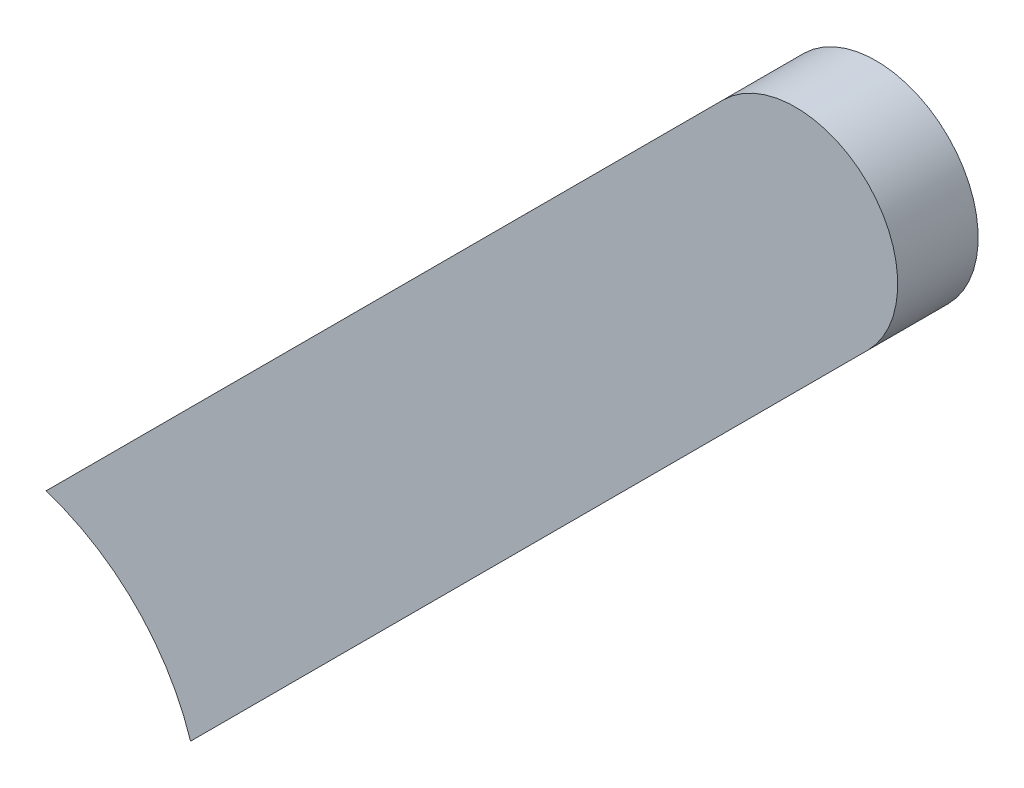
ISO-10303-21;
HEADER;
FILE_DESCRIPTION(('STEP AP214'),'2;1');
FILE_NAME('part.step','',(''),(''),'','','');
FILE_SCHEMA(('AUTOMOTIVE_DESIGN { 1 0 10303 214 1 1 1 1 }'));
ENDSEC;
DATA;
#1=APPLICATION_CONTEXT('core data for automotive mechanical design processes');
#2=APPLICATION_PROTOCOL_DEFINITION('international standard','automotive_design',2000,#1);
#3=PRODUCT_CONTEXT('',#1,'mechanical');
#4=PRODUCT('Part','Part','',(#3));
#5=PRODUCT_RELATED_PRODUCT_CATEGORY('part','',(#4));
#6=PRODUCT_DEFINITION_FORMATION('','',#4);
#7=PRODUCT_DEFINITION_CONTEXT('part definition',#1,'design');
#8=PRODUCT_DEFINITION('design','',#6,#7);
#9=PRODUCT_DEFINITION_SHAPE('','',#8);
#10=(LENGTH_UNIT() NAMED_UNIT(*) SI_UNIT(.MILLI.,.METRE.));
#11=(NAMED_UNIT(*) PLANE_ANGLE_UNIT() SI_UNIT($,.RADIAN.));
#12=(NAMED_UNIT(*) SI_UNIT($,.STERADIAN.) SOLID_ANGLE_UNIT());
#13=UNCERTAINTY_MEASURE_WITH_UNIT(LENGTH_MEASURE(1.E-05),#10,'distance_accuracy_value','');
#14=(GEOMETRIC_REPRESENTATION_CONTEXT(3) GLOBAL_UNCERTAINTY_ASSIGNED_CONTEXT((#13)) GLOBAL_UNIT_ASSIGNED_CONTEXT((#10,
#11,#12)) REPRESENTATION_CONTEXT('',''));
#15=CARTESIAN_POINT('',(0.,0.,0.));
#16=DIRECTION('',(0.,0.,1.));
#17=DIRECTION('',(1.,0.,0.));
#18=AXIS2_PLACEMENT_3D('',#15,#16,#17);
#19=CARTESIAN_POINT('',(134.259538404847,86.0183318648469,0.));
#20=DIRECTION('',(-0.707106781186548,0.707106781186548,0.));
#21=DIRECTION('',(0.707106781186548,0.707106781186548,0.));
#22=AXIS2_PLACEMENT_3D('',#19,#20,#21);
#23=PLANE('',#22);
#24=DIRECTION('',(0.707106781186548,0.707106781186548,0.));
#25=VECTOR('',#24,1.);
#26=CARTESIAN_POINT('',(133.91060594,85.6693994,0.1999996));
#27=LINE('',#26,#25);
#28=CARTESIAN_POINT('',(134.259538404847,86.0183318648469,0.1999996));
#29=VERTEX_POINT('',#28);
#30=CARTESIAN_POINT('',(135.9426034,87.70139686,0.1999996));
#31=VERTEX_POINT('',#30);
#32=EDGE_CURVE('E11',#29,#31,#27,.T.);
#33=ORIENTED_EDGE('',*,*,#32,.F.);
#34=DIRECTION('',(0.,0.,1.));
#35=VECTOR('',#34,1.);
#36=CARTESIAN_POINT('',(134.259538404847,86.0183318648469,0.));
#37=LINE('',#36,#35);
#38=CARTESIAN_POINT('',(134.259538404847,86.0183318648469,0.));
#39=VERTEX_POINT('',#38);
#40=EDGE_CURVE('E24',#39,#29,#37,.T.);
#41=ORIENTED_EDGE('',*,*,#40,.F.);
#42=DIRECTION('',(0.707106781186548,0.707106781186548,0.));
#43=VECTOR('',#42,1.);
#44=CARTESIAN_POINT('',(133.91060594,85.6693994,0.));
#45=LINE('',#44,#43);
#46=CARTESIAN_POINT('',(135.9426034,87.70139686,0.));
#47=VERTEX_POINT('',#46);
#48=EDGE_CURVE('E75',#39,#47,#45,.T.);
#49=ORIENTED_EDGE('',*,*,#48,.T.);
#50=DIRECTION('',(0.,0.,1.));
#51=VECTOR('',#50,1.);
#52=CARTESIAN_POINT('',(135.9426034,87.70139686,0.));
#53=LINE('',#52,#51);
#54=EDGE_CURVE('E37',#47,#31,#53,.T.);
#55=ORIENTED_EDGE('',*,*,#54,.T.);
#56=EDGE_LOOP('',(#33,#41,#49,#55));
#57=FACE_BOUND('',#56,.T.);
#58=ADVANCED_FACE('F17',(#57),#23,.F.);
#59=CARTESIAN_POINT('',(135.76299873,87.88100153,0.));
#60=DIRECTION('',(0.,0.,-1.));
#61=DIRECTION('',(0.707106781186576,-0.70710678118652,0.));
#62=AXIS2_PLACEMENT_3D('',#59,#60,#61);
#63=CYLINDRICAL_SURFACE('',#62,0.253999360179546);
#64=CARTESIAN_POINT('',(135.76299873,87.88100153,0.1999996));
#65=DIRECTION('',(0.,0.,1.));
#66=DIRECTION('',(0.707106781186576,-0.70710678118652,0.));
#67=AXIS2_PLACEMENT_3D('',#64,#65,#66);
#68=CIRCLE('',#67,0.253999360179546);
#69=CARTESIAN_POINT('',(135.58339406,88.0606062,0.1999996));
#70=VERTEX_POINT('',#69);
#71=EDGE_CURVE('E83',#31,#70,#68,.T.);
#72=ORIENTED_EDGE('',*,*,#71,.F.);
#73=ORIENTED_EDGE('',*,*,#54,.F.);
#74=CARTESIAN_POINT('',(135.76299873,87.88100153,0.));
#75=DIRECTION('',(0.,0.,1.));
#76=DIRECTION('',(0.707106781186576,-0.70710678118652,0.));
#77=AXIS2_PLACEMENT_3D('',#74,#75,#76);
#78=CIRCLE('',#77,0.253999360179546);
#79=CARTESIAN_POINT('',(135.58339406,88.0606062,0.));
#80=VERTEX_POINT('',#79);
#81=EDGE_CURVE('E81',#47,#80,#78,.T.);
#82=ORIENTED_EDGE('',*,*,#81,.T.);
#83=DIRECTION('',(0.,0.,1.));
#84=VECTOR('',#83,1.);
#85=CARTESIAN_POINT('',(135.58339406,88.0606062,0.));
#86=LINE('',#85,#84);
#87=EDGE_CURVE('E67',#80,#70,#86,.T.);
#88=ORIENTED_EDGE('',*,*,#87,.T.);
#89=EDGE_LOOP('',(#72,#73,#82,#88));
#90=FACE_BOUND('',#89,.T.);
#91=ADVANCED_FACE('F89',(#90),#63,.T.);
#92=CARTESIAN_POINT('',(135.58339406,88.0606062,0.));
#93=DIRECTION('',(0.70710678118655,-0.707106781186545,0.));
#94=DIRECTION('',(-0.707106781186545,-0.70710678118655,0.));
#95=AXIS2_PLACEMENT_3D('',#92,#93,#94);
#96=PLANE('',#95);
#97=DIRECTION('',(-0.707106781186545,-0.70710678118655,0.));
#98=VECTOR('',#97,1.);
#99=CARTESIAN_POINT('',(135.58339406,88.0606062,0.1999996));
#100=LINE('',#99,#98);
#101=CARTESIAN_POINT('',(133.900329064847,86.3775412048469,0.1999996));
#102=VERTEX_POINT('',#101);
#103=EDGE_CURVE('E71',#70,#102,#100,.T.);
#104=ORIENTED_EDGE('',*,*,#103,.F.);
#105=ORIENTED_EDGE('',*,*,#87,.F.);
#106=DIRECTION('',(-0.707106781186545,-0.70710678118655,0.));
#107=VECTOR('',#106,1.);
#108=CARTESIAN_POINT('',(135.58339406,88.0606062,0.));
#109=LINE('',#108,#107);
#110=CARTESIAN_POINT('',(133.900329064847,86.3775412048469,0.));
#111=VERTEX_POINT('',#110);
#112=EDGE_CURVE('E63',#80,#111,#109,.T.);
#113=ORIENTED_EDGE('',*,*,#112,.T.);
#114=DIRECTION('',(0.,0.,1.));
#115=VECTOR('',#114,1.);
#116=CARTESIAN_POINT('',(133.900329064847,86.3775412048469,0.));
#117=LINE('',#116,#115);
#118=EDGE_CURVE('E53',#111,#102,#117,.T.);
#119=ORIENTED_EDGE('',*,*,#118,.T.);
#120=EDGE_LOOP('',(#104,#105,#113,#119));
#121=FACE_BOUND('',#120,.T.);
#122=ADVANCED_FACE('F66',(#121),#96,.F.);
#123=CARTESIAN_POINT('',(133.731,85.8490028,0.));
#124=DIRECTION('',(0.,0.,-1.));
#125=DIRECTION('',(1.,0.,0.));
#126=AXIS2_PLACEMENT_3D('',#123,#124,#125);
#127=CYLINDRICAL_SURFACE('',#126,0.55500016);
#128=ORIENTED_EDGE('',*,*,#40,.T.);
#129=CARTESIAN_POINT('',(133.731,85.8490028,0.1999996));
#130=DIRECTION('',(0.,0.,1.));
#131=DIRECTION('',(1.,0.,0.));
#132=AXIS2_PLACEMENT_3D('',#129,#130,#131);
#133=CIRCLE('',#132,0.55500016);
#134=EDGE_CURVE('E59',#29,#102,#133,.T.);
#135=ORIENTED_EDGE('',*,*,#134,.T.);
#136=ORIENTED_EDGE('',*,*,#118,.F.);
#137=CARTESIAN_POINT('',(133.731,85.8490028,0.));
#138=DIRECTION('',(0.,0.,1.));
#139=DIRECTION('',(1.,0.,0.));
#140=AXIS2_PLACEMENT_3D('',#137,#138,#139);
#141=CIRCLE('',#140,0.55500016);
#142=EDGE_CURVE('E57',#39,#111,#141,.T.);
#143=ORIENTED_EDGE('',*,*,#142,.F.);
#144=EDGE_LOOP('',(#128,#135,#136,#143));
#145=FACE_BOUND('',#144,.T.);
#146=ADVANCED_FACE('F55',(#145),#127,.F.);
#147=CARTESIAN_POINT('',(133.91060594,85.6693994,0.));
#148=DIRECTION('',(0.,0.,-1.));
#149=DIRECTION('',(-1.,0.,0.));
#150=AXIS2_PLACEMENT_3D('',#147,#148,#149);
#151=PLANE('',#150);
#152=ORIENTED_EDGE('',*,*,#48,.F.);
#153=ORIENTED_EDGE('',*,*,#142,.T.);
#154=ORIENTED_EDGE('',*,*,#112,.F.);
#155=ORIENTED_EDGE('',*,*,#81,.F.);
#156=EDGE_LOOP('',(#152,#153,#154,#155));
#157=FACE_BOUND('',#156,.T.);
#158=ADVANCED_FACE('F74',(#157),#151,.T.);
#159=CARTESIAN_POINT('',(133.91060594,85.6693994,0.1999996));
#160=DIRECTION('',(0.,0.,-1.));
#161=DIRECTION('',(-1.,0.,0.));
#162=AXIS2_PLACEMENT_3D('',#159,#160,#161);
#163=PLANE('',#162);
#164=ORIENTED_EDGE('',*,*,#134,.F.);
#165=ORIENTED_EDGE('',*,*,#32,.T.);
#166=ORIENTED_EDGE('',*,*,#71,.T.);
#167=ORIENTED_EDGE('',*,*,#103,.T.);
#168=EDGE_LOOP('',(#164,#165,#166,#167));
#169=FACE_BOUND('',#168,.T.);
#170=ADVANCED_FACE('F91',(#169),#163,.F.);
#171=CLOSED_SHELL('',(#58,#91,#122,#146,#158,#170));
#172=MANIFOLD_SOLID_BREP('B1',#171);
#173=ADVANCED_BREP_SHAPE_REPRESENTATION('',(#18,#172),#14);
#174=SHAPE_DEFINITION_REPRESENTATION(#9,#173);
ENDSEC;
END-ISO-10303-21;
